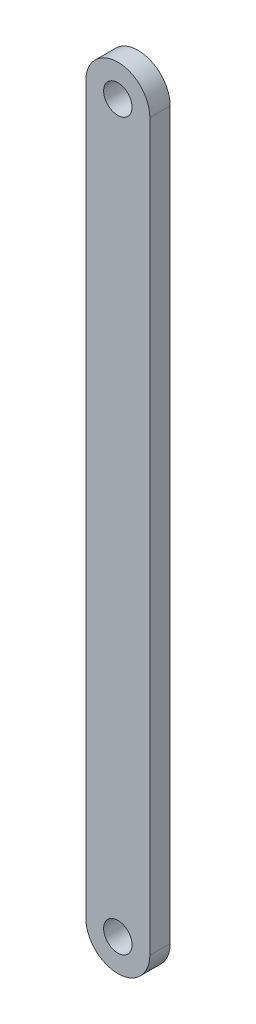
ISO-10303-21;
HEADER;
FILE_DESCRIPTION(('STEP AP214'),'2;1');
FILE_NAME('part.step','',(''),(''),'','','');
FILE_SCHEMA(('AUTOMOTIVE_DESIGN { 1 0 10303 214 1 1 1 1 }'));
ENDSEC;
DATA;
#1=APPLICATION_CONTEXT('core data for automotive mechanical design processes');
#2=APPLICATION_PROTOCOL_DEFINITION('international standard','automotive_design',2000,#1);
#3=PRODUCT_CONTEXT('',#1,'mechanical');
#4=PRODUCT('Part','Part','',(#3));
#5=PRODUCT_RELATED_PRODUCT_CATEGORY('part','',(#4));
#6=PRODUCT_DEFINITION_FORMATION('','',#4);
#7=PRODUCT_DEFINITION_CONTEXT('part definition',#1,'design');
#8=PRODUCT_DEFINITION('design','',#6,#7);
#9=PRODUCT_DEFINITION_SHAPE('','',#8);
#10=(LENGTH_UNIT() NAMED_UNIT(*) SI_UNIT(.MILLI.,.METRE.));
#11=(NAMED_UNIT(*) PLANE_ANGLE_UNIT() SI_UNIT($,.RADIAN.));
#12=(NAMED_UNIT(*) SI_UNIT($,.STERADIAN.) SOLID_ANGLE_UNIT());
#13=UNCERTAINTY_MEASURE_WITH_UNIT(LENGTH_MEASURE(1.E-05),#10,'distance_accuracy_value','');
#14=(GEOMETRIC_REPRESENTATION_CONTEXT(3) GLOBAL_UNCERTAINTY_ASSIGNED_CONTEXT((#13)) GLOBAL_UNIT_ASSIGNED_CONTEXT((#10,
#11,#12)) REPRESENTATION_CONTEXT('',''));
#15=CARTESIAN_POINT('',(0.,0.,0.));
#16=DIRECTION('',(0.,0.,1.));
#17=DIRECTION('',(1.,0.,0.));
#18=AXIS2_PLACEMENT_3D('',#15,#16,#17);
#19=CARTESIAN_POINT('',(0.,0.,4.7625));
#20=DIRECTION('',(0.,0.,1.));
#21=DIRECTION('',(1.,0.,0.));
#22=AXIS2_PLACEMENT_3D('',#19,#20,#21);
#23=PLANE('',#22);
#24=CARTESIAN_POINT('',(0.,0.,4.7625));
#25=DIRECTION('',(0.,0.,1.));
#26=DIRECTION('',(1.,0.,0.));
#27=AXIS2_PLACEMENT_3D('',#24,#25,#26);
#28=CIRCLE('',#27,3.325);
#29=CARTESIAN_POINT('',(-3.325,0.,4.7625));
#30=VERTEX_POINT('',#29);
#31=EDGE_CURVE('E102',#30,#30,#28,.T.);
#32=ORIENTED_EDGE('',*,*,#31,.F.);
#33=EDGE_LOOP('',(#32));
#34=FACE_BOUND('',#33,.T.);
#35=CARTESIAN_POINT('',(0.,0.,4.7625));
#36=DIRECTION('',(0.,0.,1.));
#37=DIRECTION('',(1.,0.,0.));
#38=AXIS2_PLACEMENT_3D('',#35,#36,#37);
#39=CIRCLE('',#38,7.5);
#40=CARTESIAN_POINT('',(-7.5,0.,4.7625));
#41=VERTEX_POINT('',#40);
#42=CARTESIAN_POINT('',(7.5,0.,4.7625));
#43=VERTEX_POINT('',#42);
#44=EDGE_CURVE('E87',#41,#43,#39,.T.);
#45=ORIENTED_EDGE('',*,*,#44,.T.);
#46=DIRECTION('',(0.,1.,0.));
#47=VECTOR('',#46,1.);
#48=CARTESIAN_POINT('',(7.5,0.,4.7625));
#49=LINE('',#48,#47);
#50=CARTESIAN_POINT('',(7.5,170.,4.7625));
#51=VERTEX_POINT('',#50);
#52=EDGE_CURVE('E82',#43,#51,#49,.T.);
#53=ORIENTED_EDGE('',*,*,#52,.T.);
#54=CARTESIAN_POINT('',(0.,170.,4.7625));
#55=DIRECTION('',(0.,0.,1.));
#56=DIRECTION('',(1.,0.,0.));
#57=AXIS2_PLACEMENT_3D('',#54,#55,#56);
#58=CIRCLE('',#57,7.5);
#59=CARTESIAN_POINT('',(-7.5,170.,4.7625));
#60=VERTEX_POINT('',#59);
#61=EDGE_CURVE('E85',#51,#60,#58,.T.);
#62=ORIENTED_EDGE('',*,*,#61,.T.);
#63=DIRECTION('',(0.,-1.,0.));
#64=VECTOR('',#63,1.);
#65=CARTESIAN_POINT('',(-7.5,0.,4.7625));
#66=LINE('',#65,#64);
#67=EDGE_CURVE('E52',#60,#41,#66,.T.);
#68=ORIENTED_EDGE('',*,*,#67,.T.);
#69=EDGE_LOOP('',(#45,#53,#62,#68));
#70=FACE_BOUND('',#69,.T.);
#71=CARTESIAN_POINT('',(0.,170.,4.7625));
#72=DIRECTION('',(0.,0.,1.));
#73=DIRECTION('',(1.,0.,0.));
#74=AXIS2_PLACEMENT_3D('',#71,#72,#73);
#75=CIRCLE('',#74,3.325);
#76=CARTESIAN_POINT('',(-3.325,170.,4.7625));
#77=VERTEX_POINT('',#76);
#78=EDGE_CURVE('E117',#77,#77,#75,.T.);
#79=ORIENTED_EDGE('',*,*,#78,.F.);
#80=EDGE_LOOP('',(#79));
#81=FACE_BOUND('',#80,.T.);
#82=ADVANCED_FACE('F35',(#34,#70,#81),#23,.T.);
#83=CARTESIAN_POINT('',(0.,0.,0.));
#84=DIRECTION('',(0.,0.,1.));
#85=DIRECTION('',(1.,0.,0.));
#86=AXIS2_PLACEMENT_3D('',#83,#84,#85);
#87=PLANE('',#86);
#88=CARTESIAN_POINT('',(0.,0.,0.));
#89=DIRECTION('',(0.,0.,1.));
#90=DIRECTION('',(1.,0.,0.));
#91=AXIS2_PLACEMENT_3D('',#88,#89,#90);
#92=CIRCLE('',#91,7.5);
#93=CARTESIAN_POINT('',(-7.5,0.,0.));
#94=VERTEX_POINT('',#93);
#95=CARTESIAN_POINT('',(7.5,0.,0.));
#96=VERTEX_POINT('',#95);
#97=EDGE_CURVE('E99',#94,#96,#92,.T.);
#98=ORIENTED_EDGE('',*,*,#97,.F.);
#99=DIRECTION('',(0.,-1.,0.));
#100=VECTOR('',#99,1.);
#101=CARTESIAN_POINT('',(-7.5,0.,0.));
#102=LINE('',#101,#100);
#103=CARTESIAN_POINT('',(-7.5,170.,0.));
#104=VERTEX_POINT('',#103);
#105=EDGE_CURVE('E75',#104,#94,#102,.T.);
#106=ORIENTED_EDGE('',*,*,#105,.F.);
#107=CARTESIAN_POINT('',(0.,170.,0.));
#108=DIRECTION('',(0.,0.,1.));
#109=DIRECTION('',(1.,0.,0.));
#110=AXIS2_PLACEMENT_3D('',#107,#108,#109);
#111=CIRCLE('',#110,7.5);
#112=CARTESIAN_POINT('',(7.5,170.,0.));
#113=VERTEX_POINT('',#112);
#114=EDGE_CURVE('E69',#113,#104,#111,.T.);
#115=ORIENTED_EDGE('',*,*,#114,.F.);
#116=DIRECTION('',(0.,1.,0.));
#117=VECTOR('',#116,1.);
#118=CARTESIAN_POINT('',(7.5,0.,0.));
#119=LINE('',#118,#117);
#120=EDGE_CURVE('E91',#96,#113,#119,.T.);
#121=ORIENTED_EDGE('',*,*,#120,.F.);
#122=EDGE_LOOP('',(#98,#106,#115,#121));
#123=FACE_BOUND('',#122,.T.);
#124=CARTESIAN_POINT('',(0.,0.,0.));
#125=DIRECTION('',(0.,0.,1.));
#126=DIRECTION('',(1.,0.,0.));
#127=AXIS2_PLACEMENT_3D('',#124,#125,#126);
#128=CIRCLE('',#127,3.325);
#129=CARTESIAN_POINT('',(-3.325,0.,0.));
#130=VERTEX_POINT('',#129);
#131=EDGE_CURVE('E114',#130,#130,#128,.T.);
#132=ORIENTED_EDGE('',*,*,#131,.T.);
#133=EDGE_LOOP('',(#132));
#134=FACE_BOUND('',#133,.T.);
#135=CARTESIAN_POINT('',(0.,170.,0.));
#136=DIRECTION('',(0.,0.,1.));
#137=DIRECTION('',(1.,0.,0.));
#138=AXIS2_PLACEMENT_3D('',#135,#136,#137);
#139=CIRCLE('',#138,3.325);
#140=CARTESIAN_POINT('',(-3.325,170.,0.));
#141=VERTEX_POINT('',#140);
#142=EDGE_CURVE('E120',#141,#141,#139,.T.);
#143=ORIENTED_EDGE('',*,*,#142,.T.);
#144=EDGE_LOOP('',(#143));
#145=FACE_BOUND('',#144,.T.);
#146=ADVANCED_FACE('F110',(#123,#134,#145),#87,.F.);
#147=CARTESIAN_POINT('',(0.,0.,4.7625));
#148=DIRECTION('',(0.,0.,-1.));
#149=DIRECTION('',(-1.,0.,0.));
#150=AXIS2_PLACEMENT_3D('',#147,#148,#149);
#151=CYLINDRICAL_SURFACE('',#150,7.5);
#152=ORIENTED_EDGE('',*,*,#97,.T.);
#153=DIRECTION('',(0.,0.,-1.));
#154=VECTOR('',#153,1.);
#155=CARTESIAN_POINT('',(7.5,0.,4.7625));
#156=LINE('',#155,#154);
#157=EDGE_CURVE('E11',#43,#96,#156,.T.);
#158=ORIENTED_EDGE('',*,*,#157,.F.);
#159=ORIENTED_EDGE('',*,*,#44,.F.);
#160=DIRECTION('',(0.,0.,-1.));
#161=VECTOR('',#160,1.);
#162=CARTESIAN_POINT('',(-7.5,0.,4.7625));
#163=LINE('',#162,#161);
#164=EDGE_CURVE('E95',#41,#94,#163,.T.);
#165=ORIENTED_EDGE('',*,*,#164,.T.);
#166=EDGE_LOOP('',(#152,#158,#159,#165));
#167=FACE_BOUND('',#166,.T.);
#168=ADVANCED_FACE('F37',(#167),#151,.T.);
#169=CARTESIAN_POINT('',(7.5,0.,4.7625));
#170=DIRECTION('',(-1.,0.,0.));
#171=DIRECTION('',(0.,0.,1.));
#172=AXIS2_PLACEMENT_3D('',#169,#170,#171);
#173=PLANE('',#172);
#174=ORIENTED_EDGE('',*,*,#120,.T.);
#175=DIRECTION('',(0.,0.,-1.));
#176=VECTOR('',#175,1.);
#177=CARTESIAN_POINT('',(7.5,170.,4.7625));
#178=LINE('',#177,#176);
#179=EDGE_CURVE('E44',#51,#113,#178,.T.);
#180=ORIENTED_EDGE('',*,*,#179,.F.);
#181=ORIENTED_EDGE('',*,*,#52,.F.);
#182=ORIENTED_EDGE('',*,*,#157,.T.);
#183=EDGE_LOOP('',(#174,#180,#181,#182));
#184=FACE_BOUND('',#183,.T.);
#185=ADVANCED_FACE('F90',(#184),#173,.F.);
#186=CARTESIAN_POINT('',(0.,170.,4.7625));
#187=DIRECTION('',(0.,0.,-1.));
#188=DIRECTION('',(-1.,0.,0.));
#189=AXIS2_PLACEMENT_3D('',#186,#187,#188);
#190=CYLINDRICAL_SURFACE('',#189,7.5);
#191=ORIENTED_EDGE('',*,*,#114,.T.);
#192=DIRECTION('',(0.,0.,-1.));
#193=VECTOR('',#192,1.);
#194=CARTESIAN_POINT('',(-7.5,170.,4.7625));
#195=LINE('',#194,#193);
#196=EDGE_CURVE('E92',#60,#104,#195,.T.);
#197=ORIENTED_EDGE('',*,*,#196,.F.);
#198=ORIENTED_EDGE('',*,*,#61,.F.);
#199=ORIENTED_EDGE('',*,*,#179,.T.);
#200=EDGE_LOOP('',(#191,#197,#198,#199));
#201=FACE_BOUND('',#200,.T.);
#202=ADVANCED_FACE('F93',(#201),#190,.T.);
#203=CARTESIAN_POINT('',(-7.5,0.,4.7625));
#204=DIRECTION('',(1.,0.,0.));
#205=DIRECTION('',(0.,0.,-1.));
#206=AXIS2_PLACEMENT_3D('',#203,#204,#205);
#207=PLANE('',#206);
#208=ORIENTED_EDGE('',*,*,#105,.T.);
#209=ORIENTED_EDGE('',*,*,#164,.F.);
#210=ORIENTED_EDGE('',*,*,#67,.F.);
#211=ORIENTED_EDGE('',*,*,#196,.T.);
#212=EDGE_LOOP('',(#208,#209,#210,#211));
#213=FACE_BOUND('',#212,.T.);
#214=ADVANCED_FACE('F107',(#213),#207,.F.);
#215=CARTESIAN_POINT('',(0.,0.,4.7625));
#216=DIRECTION('',(0.,0.,-1.));
#217=DIRECTION('',(-1.,0.,0.));
#218=AXIS2_PLACEMENT_3D('',#215,#216,#217);
#219=CYLINDRICAL_SURFACE('',#218,3.325);
#220=CARTESIAN_POINT('',(-3.325,0.,4.7625));
#221=CARTESIAN_POINT('',(-3.325,0.,4.712890625));
#222=CARTESIAN_POINT('',(-3.325,0.,4.66328125));
#223=CARTESIAN_POINT('',(-3.325,0.,4.5640625));
#224=CARTESIAN_POINT('',(-3.325,0.,4.514453125));
#225=CARTESIAN_POINT('',(-3.325,0.,4.415234375));
#226=CARTESIAN_POINT('',(-3.325,0.,4.365625));
#227=CARTESIAN_POINT('',(-3.325,0.,4.26640625));
#228=CARTESIAN_POINT('',(-3.325,0.,4.216796875));
#229=CARTESIAN_POINT('',(-3.325,0.,4.117578125));
#230=CARTESIAN_POINT('',(-3.325,0.,4.06796875));
#231=CARTESIAN_POINT('',(-3.325,0.,3.96875));
#232=CARTESIAN_POINT('',(-3.325,0.,3.919140625));
#233=CARTESIAN_POINT('',(-3.325,0.,3.819921875));
#234=CARTESIAN_POINT('',(-3.325,0.,3.7703125));
#235=CARTESIAN_POINT('',(-3.325,0.,3.67109375));
#236=CARTESIAN_POINT('',(-3.325,0.,3.621484375));
#237=CARTESIAN_POINT('',(-3.325,0.,3.522265625));
#238=CARTESIAN_POINT('',(-3.325,0.,3.47265625));
#239=CARTESIAN_POINT('',(-3.325,0.,3.3734375));
#240=CARTESIAN_POINT('',(-3.325,0.,3.323828125));
#241=CARTESIAN_POINT('',(-3.325,0.,3.224609375));
#242=CARTESIAN_POINT('',(-3.325,0.,3.175));
#243=CARTESIAN_POINT('',(-3.325,0.,3.07578125));
#244=CARTESIAN_POINT('',(-3.325,0.,3.026171875));
#245=CARTESIAN_POINT('',(-3.325,0.,2.926953125));
#246=CARTESIAN_POINT('',(-3.325,0.,2.87734375));
#247=CARTESIAN_POINT('',(-3.325,0.,2.778125));
#248=CARTESIAN_POINT('',(-3.325,0.,2.728515625));
#249=CARTESIAN_POINT('',(-3.325,0.,2.629296875));
#250=CARTESIAN_POINT('',(-3.325,0.,2.5796875));
#251=CARTESIAN_POINT('',(-3.325,0.,2.48046875));
#252=CARTESIAN_POINT('',(-3.325,0.,2.430859375));
#253=CARTESIAN_POINT('',(-3.325,0.,2.331640625));
#254=CARTESIAN_POINT('',(-3.325,0.,2.28203125));
#255=CARTESIAN_POINT('',(-3.325,0.,2.1828125));
#256=CARTESIAN_POINT('',(-3.325,0.,2.133203125));
#257=CARTESIAN_POINT('',(-3.325,0.,2.033984375));
#258=CARTESIAN_POINT('',(-3.325,0.,1.984375));
#259=CARTESIAN_POINT('',(-3.325,0.,1.88515625));
#260=CARTESIAN_POINT('',(-3.325,0.,1.835546875));
#261=CARTESIAN_POINT('',(-3.325,0.,1.736328125));
#262=CARTESIAN_POINT('',(-3.325,0.,1.68671875));
#263=CARTESIAN_POINT('',(-3.325,0.,1.5875));
#264=CARTESIAN_POINT('',(-3.325,0.,1.537890625));
#265=CARTESIAN_POINT('',(-3.325,0.,1.438671875));
#266=CARTESIAN_POINT('',(-3.325,0.,1.3890625));
#267=CARTESIAN_POINT('',(-3.325,0.,1.28984375));
#268=CARTESIAN_POINT('',(-3.325,0.,1.240234375));
#269=CARTESIAN_POINT('',(-3.325,0.,1.141015625));
#270=CARTESIAN_POINT('',(-3.325,0.,1.09140625));
#271=CARTESIAN_POINT('',(-3.325,0.,0.9921875));
#272=CARTESIAN_POINT('',(-3.325,0.,0.942578125));
#273=CARTESIAN_POINT('',(-3.325,0.,0.843359375));
#274=CARTESIAN_POINT('',(-3.325,0.,0.79375));
#275=CARTESIAN_POINT('',(-3.325,0.,0.69453125));
#276=CARTESIAN_POINT('',(-3.325,0.,0.644921875));
#277=CARTESIAN_POINT('',(-3.325,0.,0.545703125));
#278=CARTESIAN_POINT('',(-3.325,0.,0.49609375));
#279=CARTESIAN_POINT('',(-3.325,0.,0.396875));
#280=CARTESIAN_POINT('',(-3.325,0.,0.347265625));
#281=CARTESIAN_POINT('',(-3.325,0.,0.248046875));
#282=CARTESIAN_POINT('',(-3.325,0.,0.1984375));
#283=CARTESIAN_POINT('',(-3.325,0.,0.09921875));
#284=CARTESIAN_POINT('',(-3.325,0.,0.049609375));
#285=CARTESIAN_POINT('',(-3.325,0.,0.));
#286=B_SPLINE_CURVE_WITH_KNOTS('',3,(#220,#221,#222,#223,#224,#225,#226,#227,#228,#229,#230,
#231,#232,#233,#234,#235,#236,#237,#238,#239,#240,#241,#242,#243,#244,#245,#246,#247,#248,#249,
#250,#251,#252,#253,#254,#255,#256,#257,#258,#259,#260,#261,#262,#263,#264,#265,#266,#267,#268,
#269,#270,#271,#272,#273,#274,#275,#276,#277,#278,#279,#280,#281,#282,#283,#284,#285),
.UNSPECIFIED.,.F.,.F.,(4,2,2,2,2,2,2,2,2,2,2,2,2,2,2,2,2,2,2,2,2,2,2,2,2,2,2,2,2,2,2,2,4),(0.,
0.148828124999999,0.297656249999999,0.446484374999999,0.595312499999999,0.744140625,0.89296875,
1.041796875,1.190625,1.339453125,1.48828125,1.637109375,1.7859375,1.934765625,2.08359375,
2.232421875,2.38125,2.530078125,2.67890625,2.827734375,2.9765625,3.125390625,3.27421875,
3.423046875,3.571875,3.720703125,3.86953125,4.018359375,4.1671875,4.316015625,4.46484375,
4.613671875,4.7625),.UNSPECIFIED.);
#287=EDGE_CURVE('BSEAM137',#30,#130,#286,.T.);
#288=ORIENTED_EDGE('',*,*,#31,.T.);
#289=ORIENTED_EDGE('',*,*,#131,.F.);
#290=ORIENTED_EDGE('',*,*,#287,.T.);
#291=ORIENTED_EDGE('',*,*,#287,.F.);
#292=EDGE_LOOP('',(#288,#290,#289,#291));
#293=FACE_BOUND('',#292,.T.);
#294=ADVANCED_FACE('F137',(#293),#219,.F.);
#295=CARTESIAN_POINT('',(0.,170.,4.7625));
#296=DIRECTION('',(0.,0.,-1.));
#297=DIRECTION('',(-1.,0.,0.));
#298=AXIS2_PLACEMENT_3D('',#295,#296,#297);
#299=CYLINDRICAL_SURFACE('',#298,3.325);
#300=CARTESIAN_POINT('',(-3.325,170.,4.7625));
#301=CARTESIAN_POINT('',(-3.325,170.,4.712890625));
#302=CARTESIAN_POINT('',(-3.325,170.,4.66328125));
#303=CARTESIAN_POINT('',(-3.325,170.,4.5640625));
#304=CARTESIAN_POINT('',(-3.325,170.,4.514453125));
#305=CARTESIAN_POINT('',(-3.325,170.,4.415234375));
#306=CARTESIAN_POINT('',(-3.325,170.,4.365625));
#307=CARTESIAN_POINT('',(-3.325,170.,4.26640625));
#308=CARTESIAN_POINT('',(-3.325,170.,4.216796875));
#309=CARTESIAN_POINT('',(-3.325,170.,4.117578125));
#310=CARTESIAN_POINT('',(-3.325,170.,4.06796875));
#311=CARTESIAN_POINT('',(-3.325,170.,3.96875));
#312=CARTESIAN_POINT('',(-3.325,170.,3.919140625));
#313=CARTESIAN_POINT('',(-3.325,170.,3.819921875));
#314=CARTESIAN_POINT('',(-3.325,170.,3.7703125));
#315=CARTESIAN_POINT('',(-3.325,170.,3.67109375));
#316=CARTESIAN_POINT('',(-3.325,170.,3.621484375));
#317=CARTESIAN_POINT('',(-3.325,170.,3.522265625));
#318=CARTESIAN_POINT('',(-3.325,170.,3.47265625));
#319=CARTESIAN_POINT('',(-3.325,170.,3.3734375));
#320=CARTESIAN_POINT('',(-3.325,170.,3.323828125));
#321=CARTESIAN_POINT('',(-3.325,170.,3.224609375));
#322=CARTESIAN_POINT('',(-3.325,170.,3.175));
#323=CARTESIAN_POINT('',(-3.325,170.,3.07578125));
#324=CARTESIAN_POINT('',(-3.325,170.,3.026171875));
#325=CARTESIAN_POINT('',(-3.325,170.,2.926953125));
#326=CARTESIAN_POINT('',(-3.325,170.,2.87734375));
#327=CARTESIAN_POINT('',(-3.325,170.,2.778125));
#328=CARTESIAN_POINT('',(-3.325,170.,2.728515625));
#329=CARTESIAN_POINT('',(-3.325,170.,2.629296875));
#330=CARTESIAN_POINT('',(-3.325,170.,2.5796875));
#331=CARTESIAN_POINT('',(-3.325,170.,2.48046875));
#332=CARTESIAN_POINT('',(-3.325,170.,2.430859375));
#333=CARTESIAN_POINT('',(-3.325,170.,2.331640625));
#334=CARTESIAN_POINT('',(-3.325,170.,2.28203125));
#335=CARTESIAN_POINT('',(-3.325,170.,2.1828125));
#336=CARTESIAN_POINT('',(-3.325,170.,2.133203125));
#337=CARTESIAN_POINT('',(-3.325,170.,2.033984375));
#338=CARTESIAN_POINT('',(-3.325,170.,1.984375));
#339=CARTESIAN_POINT('',(-3.325,170.,1.88515625));
#340=CARTESIAN_POINT('',(-3.325,170.,1.835546875));
#341=CARTESIAN_POINT('',(-3.325,170.,1.736328125));
#342=CARTESIAN_POINT('',(-3.325,170.,1.68671875));
#343=CARTESIAN_POINT('',(-3.325,170.,1.5875));
#344=CARTESIAN_POINT('',(-3.325,170.,1.537890625));
#345=CARTESIAN_POINT('',(-3.325,170.,1.438671875));
#346=CARTESIAN_POINT('',(-3.325,170.,1.3890625));
#347=CARTESIAN_POINT('',(-3.325,170.,1.28984375));
#348=CARTESIAN_POINT('',(-3.325,170.,1.240234375));
#349=CARTESIAN_POINT('',(-3.325,170.,1.141015625));
#350=CARTESIAN_POINT('',(-3.325,170.,1.09140625));
#351=CARTESIAN_POINT('',(-3.325,170.,0.9921875));
#352=CARTESIAN_POINT('',(-3.325,170.,0.942578125));
#353=CARTESIAN_POINT('',(-3.325,170.,0.843359375));
#354=CARTESIAN_POINT('',(-3.325,170.,0.79375));
#355=CARTESIAN_POINT('',(-3.325,170.,0.69453125));
#356=CARTESIAN_POINT('',(-3.325,170.,0.644921875));
#357=CARTESIAN_POINT('',(-3.325,170.,0.545703125));
#358=CARTESIAN_POINT('',(-3.325,170.,0.49609375));
#359=CARTESIAN_POINT('',(-3.325,170.,0.396875));
#360=CARTESIAN_POINT('',(-3.325,170.,0.347265625));
#361=CARTESIAN_POINT('',(-3.325,170.,0.248046875));
#362=CARTESIAN_POINT('',(-3.325,170.,0.1984375));
#363=CARTESIAN_POINT('',(-3.325,170.,0.09921875));
#364=CARTESIAN_POINT('',(-3.325,170.,0.049609375));
#365=CARTESIAN_POINT('',(-3.325,170.,0.));
#366=B_SPLINE_CURVE_WITH_KNOTS('',3,(#300,#301,#302,#303,#304,#305,#306,#307,#308,#309,#310,
#311,#312,#313,#314,#315,#316,#317,#318,#319,#320,#321,#322,#323,#324,#325,#326,#327,#328,#329,
#330,#331,#332,#333,#334,#335,#336,#337,#338,#339,#340,#341,#342,#343,#344,#345,#346,#347,#348,
#349,#350,#351,#352,#353,#354,#355,#356,#357,#358,#359,#360,#361,#362,#363,#364,#365),
.UNSPECIFIED.,.F.,.F.,(4,2,2,2,2,2,2,2,2,2,2,2,2,2,2,2,2,2,2,2,2,2,2,2,2,2,2,2,2,2,2,2,4),(0.,
0.148828124999999,0.297656249999999,0.446484374999999,0.595312499999999,0.744140625,0.89296875,
1.041796875,1.190625,1.339453125,1.48828125,1.637109375,1.7859375,1.934765625,2.08359375,
2.232421875,2.38125,2.530078125,2.67890625,2.827734375,2.9765625,3.125390625,3.27421875,
3.423046875,3.571875,3.720703125,3.86953125,4.018359375,4.1671875,4.316015625,4.46484375,
4.613671875,4.7625),.UNSPECIFIED.);
#367=EDGE_CURVE('BSEAM126',#77,#141,#366,.T.);
#368=ORIENTED_EDGE('',*,*,#78,.T.);
#369=ORIENTED_EDGE('',*,*,#142,.F.);
#370=ORIENTED_EDGE('',*,*,#367,.T.);
#371=ORIENTED_EDGE('',*,*,#367,.F.);
#372=EDGE_LOOP('',(#368,#370,#369,#371));
#373=FACE_BOUND('',#372,.T.);
#374=ADVANCED_FACE('F126',(#373),#299,.F.);
#375=CLOSED_SHELL('',(#82,#146,#168,#185,#202,#214,#294,#374));
#376=MANIFOLD_SOLID_BREP('B2',#375);
#377=ADVANCED_BREP_SHAPE_REPRESENTATION('',(#18,#376),#14);
#378=SHAPE_DEFINITION_REPRESENTATION(#9,#377);
ENDSEC;
END-ISO-10303-21;
